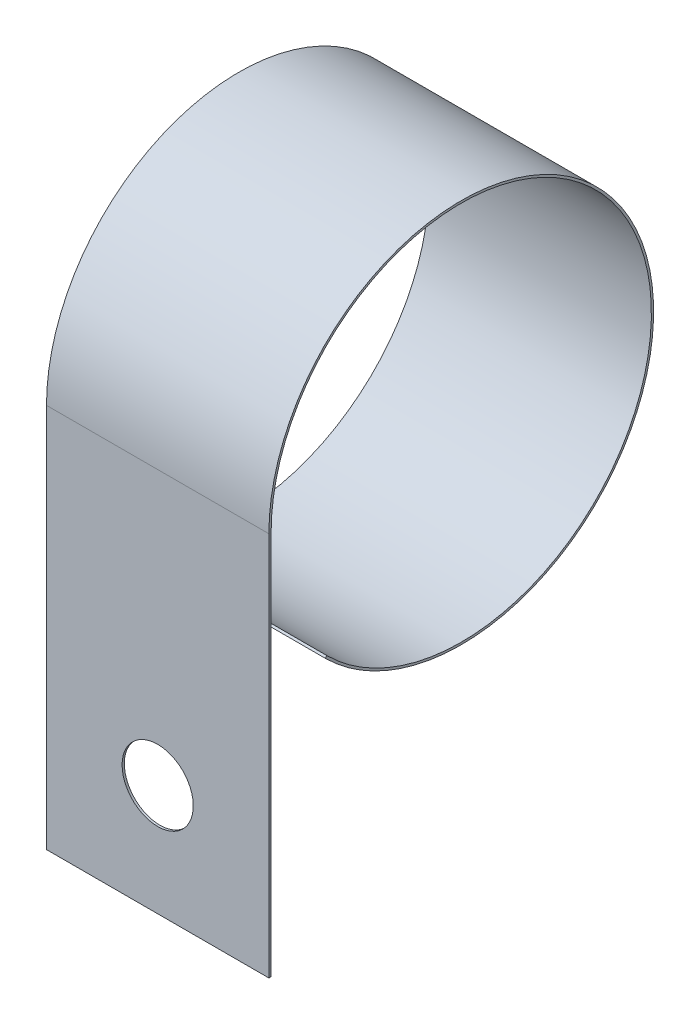
ISO-10303-21;
HEADER;
FILE_DESCRIPTION(('STEP AP214'),'2;1');
FILE_NAME('part.step','',(''),(''),'','','');
FILE_SCHEMA(('AUTOMOTIVE_DESIGN { 1 0 10303 214 1 1 1 1 }'));
ENDSEC;
DATA;
#1=APPLICATION_CONTEXT('core data for automotive mechanical design processes');
#2=APPLICATION_PROTOCOL_DEFINITION('international standard','automotive_design',2000,#1);
#3=PRODUCT_CONTEXT('',#1,'mechanical');
#4=PRODUCT('Part','Part','',(#3));
#5=PRODUCT_RELATED_PRODUCT_CATEGORY('part','',(#4));
#6=PRODUCT_DEFINITION_FORMATION('','',#4);
#7=PRODUCT_DEFINITION_CONTEXT('part definition',#1,'design');
#8=PRODUCT_DEFINITION('design','',#6,#7);
#9=PRODUCT_DEFINITION_SHAPE('','',#8);
#10=(LENGTH_UNIT() NAMED_UNIT(*) SI_UNIT(.MILLI.,.METRE.));
#11=(NAMED_UNIT(*) PLANE_ANGLE_UNIT() SI_UNIT($,.RADIAN.));
#12=(NAMED_UNIT(*) SI_UNIT($,.STERADIAN.) SOLID_ANGLE_UNIT());
#13=UNCERTAINTY_MEASURE_WITH_UNIT(LENGTH_MEASURE(1.E-05),#10,'distance_accuracy_value','');
#14=(GEOMETRIC_REPRESENTATION_CONTEXT(3) GLOBAL_UNCERTAINTY_ASSIGNED_CONTEXT((#13)) GLOBAL_UNIT_ASSIGNED_CONTEXT((#10,
#11,#12)) REPRESENTATION_CONTEXT('',''));
#15=CARTESIAN_POINT('',(0.,0.,0.));
#16=DIRECTION('',(0.,0.,1.));
#17=DIRECTION('',(1.,0.,0.));
#18=AXIS2_PLACEMENT_3D('',#15,#16,#17);
#19=CARTESIAN_POINT('',(5.,-17.3,8.65000000000003));
#20=DIRECTION('',(0.,0.,-1.));
#21=DIRECTION('',(0.,1.,0.));
#22=AXIS2_PLACEMENT_3D('',#19,#20,#21);
#23=PLANE('',#22);
#24=DIRECTION('',(0.,-1.,0.));
#25=VECTOR('',#24,1.);
#26=CARTESIAN_POINT('',(-5.,-17.3,8.65000000000003));
#27=LINE('',#26,#25);
#28=CARTESIAN_POINT('',(-5.,0.,8.65000000000003));
#29=VERTEX_POINT('',#28);
#30=CARTESIAN_POINT('',(-5.,-17.3,8.65000000000003));
#31=VERTEX_POINT('',#30);
#32=EDGE_CURVE('E129',#29,#31,#27,.T.);
#33=ORIENTED_EDGE('',*,*,#32,.T.);
#34=DIRECTION('',(-1.,0.,0.));
#35=VECTOR('',#34,1.);
#36=CARTESIAN_POINT('',(5.,-17.3,8.65000000000003));
#37=LINE('',#36,#35);
#38=CARTESIAN_POINT('',(5.,-17.3,8.65000000000003));
#39=VERTEX_POINT('',#38);
#40=EDGE_CURVE('E126',#39,#31,#37,.T.);
#41=ORIENTED_EDGE('',*,*,#40,.F.);
#42=DIRECTION('',(0.,-1.,0.));
#43=VECTOR('',#42,1.);
#44=CARTESIAN_POINT('',(5.,-17.3,8.65000000000003));
#45=LINE('',#44,#43);
#46=CARTESIAN_POINT('',(5.,0.,8.65000000000003));
#47=VERTEX_POINT('',#46);
#48=EDGE_CURVE('E114',#47,#39,#45,.T.);
#49=ORIENTED_EDGE('',*,*,#48,.F.);
#50=DIRECTION('',(-1.,0.,0.));
#51=VECTOR('',#50,1.);
#52=CARTESIAN_POINT('',(5.,0.,8.65000000000003));
#53=LINE('',#52,#51);
#54=EDGE_CURVE('E131',#47,#29,#53,.T.);
#55=ORIENTED_EDGE('',*,*,#54,.T.);
#56=EDGE_LOOP('',(#33,#41,#49,#55));
#57=FACE_BOUND('',#56,.T.);
#58=CARTESIAN_POINT('',(0.,-12.3,8.65000000000003));
#59=DIRECTION('',(0.,0.,-1.));
#60=DIRECTION('',(-1.,0.,0.));
#61=AXIS2_PLACEMENT_3D('',#58,#59,#60);
#62=CIRCLE('',#61,1.6);
#63=CARTESIAN_POINT('',(-1.6,-12.3,8.65000000000003));
#64=VERTEX_POINT('',#63);
#65=EDGE_CURVE('E146',#64,#64,#62,.T.);
#66=ORIENTED_EDGE('',*,*,#65,.T.);
#67=EDGE_LOOP('',(#66));
#68=FACE_BOUND('',#67,.T.);
#69=ADVANCED_FACE('F44',(#57,#68),#23,.F.);
#70=CARTESIAN_POINT('',(5.,-17.3,8.55000000000003));
#71=DIRECTION('',(0.,0.,1.));
#72=DIRECTION('',(0.,-1.,0.));
#73=AXIS2_PLACEMENT_3D('',#70,#71,#72);
#74=PLANE('',#73);
#75=DIRECTION('',(0.,1.,0.));
#76=VECTOR('',#75,1.);
#77=CARTESIAN_POINT('',(-5.,-17.3,8.55000000000003));
#78=LINE('',#77,#76);
#79=CARTESIAN_POINT('',(-5.,-17.3,8.55000000000003));
#80=VERTEX_POINT('',#79);
#81=CARTESIAN_POINT('',(-5.,0.,8.55000000000003));
#82=VERTEX_POINT('',#81);
#83=EDGE_CURVE('E98',#80,#82,#78,.T.);
#84=ORIENTED_EDGE('',*,*,#83,.T.);
#85=DIRECTION('',(-1.,0.,0.));
#86=VECTOR('',#85,1.);
#87=CARTESIAN_POINT('',(5.,0.,8.55000000000003));
#88=LINE('',#87,#86);
#89=CARTESIAN_POINT('',(5.,0.,8.55000000000003));
#90=VERTEX_POINT('',#89);
#91=EDGE_CURVE('E137',#90,#82,#88,.T.);
#92=ORIENTED_EDGE('',*,*,#91,.F.);
#93=DIRECTION('',(0.,1.,0.));
#94=VECTOR('',#93,1.);
#95=CARTESIAN_POINT('',(5.,-17.3,8.55000000000003));
#96=LINE('',#95,#94);
#97=CARTESIAN_POINT('',(5.,-17.3,8.55000000000003));
#98=VERTEX_POINT('',#97);
#99=EDGE_CURVE('E65',#98,#90,#96,.T.);
#100=ORIENTED_EDGE('',*,*,#99,.F.);
#101=DIRECTION('',(-1.,0.,0.));
#102=VECTOR('',#101,1.);
#103=CARTESIAN_POINT('',(5.,-17.3,8.55000000000003));
#104=LINE('',#103,#102);
#105=EDGE_CURVE('E132',#98,#80,#104,.T.);
#106=ORIENTED_EDGE('',*,*,#105,.T.);
#107=EDGE_LOOP('',(#84,#92,#100,#106));
#108=FACE_BOUND('',#107,.T.);
#109=CARTESIAN_POINT('',(0.,-12.3,8.55000000000003));
#110=DIRECTION('',(0.,0.,1.));
#111=DIRECTION('',(0.,-1.,0.));
#112=AXIS2_PLACEMENT_3D('',#109,#110,#111);
#113=CIRCLE('',#112,1.6);
#114=CARTESIAN_POINT('',(0.,-13.9,8.55000000000003));
#115=VERTEX_POINT('',#114);
#116=EDGE_CURVE('E181',#115,#115,#113,.T.);
#117=ORIENTED_EDGE('',*,*,#116,.T.);
#118=EDGE_LOOP('',(#117));
#119=FACE_BOUND('',#118,.T.);
#120=ADVANCED_FACE('F175',(#108,#119),#74,.F.);
#121=CARTESIAN_POINT('',(5.,0.,0.));
#122=DIRECTION('',(-1.,0.,0.));
#123=DIRECTION('',(0.,0.,1.));
#124=AXIS2_PLACEMENT_3D('',#121,#122,#123);
#125=CYLINDRICAL_SURFACE('',#124,8.55000000000003);
#126=CARTESIAN_POINT('',(-5.,0.,0.));
#127=DIRECTION('',(-1.,0.,0.));
#128=DIRECTION('',(0.,0.,1.));
#129=AXIS2_PLACEMENT_3D('',#126,#127,#128);
#130=CIRCLE('',#129,8.55000000000003);
#131=CARTESIAN_POINT('',(-5.,-6.04576297914498,6.04576297914503));
#132=VERTEX_POINT('',#131);
#133=EDGE_CURVE('E141',#82,#132,#130,.T.);
#134=ORIENTED_EDGE('',*,*,#133,.T.);
#135=DIRECTION('',(-1.,0.,0.));
#136=VECTOR('',#135,1.);
#137=CARTESIAN_POINT('',(5.,-6.04576297914498,6.04576297914503));
#138=LINE('',#137,#136);
#139=CARTESIAN_POINT('',(5.,-6.04576297914498,6.04576297914503));
#140=VERTEX_POINT('',#139);
#141=EDGE_CURVE('E11',#140,#132,#138,.T.);
#142=ORIENTED_EDGE('',*,*,#141,.F.);
#143=CARTESIAN_POINT('',(5.,0.,0.));
#144=DIRECTION('',(-1.,0.,0.));
#145=DIRECTION('',(0.,0.,1.));
#146=AXIS2_PLACEMENT_3D('',#143,#144,#145);
#147=CIRCLE('',#146,8.55000000000003);
#148=EDGE_CURVE('E158',#90,#140,#147,.T.);
#149=ORIENTED_EDGE('',*,*,#148,.F.);
#150=ORIENTED_EDGE('',*,*,#91,.T.);
#151=EDGE_LOOP('',(#134,#142,#149,#150));
#152=FACE_BOUND('',#151,.T.);
#153=ADVANCED_FACE('F46',(#152),#125,.F.);
#154=CARTESIAN_POINT('',(5.,-6.11647365726363,6.11647365726368));
#155=DIRECTION('',(0.,-0.707106781186539,-0.707106781186556));
#156=DIRECTION('',(0.,0.707106781186556,-0.707106781186539));
#157=AXIS2_PLACEMENT_3D('',#154,#155,#156);
#158=PLANE('',#157);
#159=DIRECTION('',(0.,-0.707106781186556,0.707106781186539));
#160=VECTOR('',#159,1.);
#161=CARTESIAN_POINT('',(-5.,-6.11647365726363,6.11647365726368));
#162=LINE('',#161,#160);
#163=CARTESIAN_POINT('',(-5.,-6.11647365726363,6.11647365726368));
#164=VERTEX_POINT('',#163);
#165=EDGE_CURVE('E145',#132,#164,#162,.T.);
#166=ORIENTED_EDGE('',*,*,#165,.T.);
#167=DIRECTION('',(-1.,0.,0.));
#168=VECTOR('',#167,1.);
#169=CARTESIAN_POINT('',(5.,-6.11647365726363,6.11647365726368));
#170=LINE('',#169,#168);
#171=CARTESIAN_POINT('',(5.,-6.11647365726363,6.11647365726368));
#172=VERTEX_POINT('',#171);
#173=EDGE_CURVE('E54',#172,#164,#170,.T.);
#174=ORIENTED_EDGE('',*,*,#173,.F.);
#175=DIRECTION('',(0.,-0.707106781186556,0.707106781186539));
#176=VECTOR('',#175,1.);
#177=CARTESIAN_POINT('',(5.,-6.11647365726363,6.11647365726368));
#178=LINE('',#177,#176);
#179=EDGE_CURVE('E107',#140,#172,#178,.T.);
#180=ORIENTED_EDGE('',*,*,#179,.F.);
#181=ORIENTED_EDGE('',*,*,#141,.T.);
#182=EDGE_LOOP('',(#166,#174,#180,#181));
#183=FACE_BOUND('',#182,.T.);
#184=ADVANCED_FACE('F210',(#183),#158,.F.);
#185=CARTESIAN_POINT('',(5.,0.,0.));
#186=DIRECTION('',(-1.,0.,0.));
#187=DIRECTION('',(0.,0.,1.));
#188=AXIS2_PLACEMENT_3D('',#185,#186,#187);
#189=CYLINDRICAL_SURFACE('',#188,8.65000000000003);
#190=CARTESIAN_POINT('',(-5.,0.,0.));
#191=DIRECTION('',(1.,0.,0.));
#192=DIRECTION('',(0.,0.,1.));
#193=AXIS2_PLACEMENT_3D('',#190,#191,#192);
#194=CIRCLE('',#193,8.65000000000003);
#195=EDGE_CURVE('E149',#164,#29,#194,.T.);
#196=ORIENTED_EDGE('',*,*,#195,.T.);
#197=ORIENTED_EDGE('',*,*,#54,.F.);
#198=CARTESIAN_POINT('',(5.,0.,0.));
#199=DIRECTION('',(1.,0.,0.));
#200=DIRECTION('',(0.,0.,1.));
#201=AXIS2_PLACEMENT_3D('',#198,#199,#200);
#202=CIRCLE('',#201,8.65000000000003);
#203=EDGE_CURVE('E120',#172,#47,#202,.T.);
#204=ORIENTED_EDGE('',*,*,#203,.F.);
#205=ORIENTED_EDGE('',*,*,#173,.T.);
#206=EDGE_LOOP('',(#196,#197,#204,#205));
#207=FACE_BOUND('',#206,.T.);
#208=ADVANCED_FACE('F168',(#207),#189,.T.);
#209=CARTESIAN_POINT('',(5.,-17.3,8.55000000000003));
#210=DIRECTION('',(0.,1.,0.));
#211=DIRECTION('',(0.,0.,1.));
#212=AXIS2_PLACEMENT_3D('',#209,#210,#211);
#213=PLANE('',#212);
#214=DIRECTION('',(0.,0.,-1.));
#215=VECTOR('',#214,1.);
#216=CARTESIAN_POINT('',(-5.,-17.3,8.55000000000003));
#217=LINE('',#216,#215);
#218=EDGE_CURVE('E92',#31,#80,#217,.T.);
#219=ORIENTED_EDGE('',*,*,#218,.T.);
#220=ORIENTED_EDGE('',*,*,#105,.F.);
#221=DIRECTION('',(0.,0.,-1.));
#222=VECTOR('',#221,1.);
#223=CARTESIAN_POINT('',(5.,-17.3,8.55000000000003));
#224=LINE('',#223,#222);
#225=EDGE_CURVE('E118',#39,#98,#224,.T.);
#226=ORIENTED_EDGE('',*,*,#225,.F.);
#227=ORIENTED_EDGE('',*,*,#40,.T.);
#228=EDGE_LOOP('',(#219,#220,#226,#227));
#229=FACE_BOUND('',#228,.T.);
#230=ADVANCED_FACE('F134',(#229),#213,.F.);
#231=CARTESIAN_POINT('',(5.,0.,0.));
#232=DIRECTION('',(-1.,0.,0.));
#233=DIRECTION('',(0.,0.,1.));
#234=AXIS2_PLACEMENT_3D('',#231,#232,#233);
#235=PLANE('',#234);
#236=ORIENTED_EDGE('',*,*,#148,.T.);
#237=ORIENTED_EDGE('',*,*,#179,.T.);
#238=ORIENTED_EDGE('',*,*,#203,.T.);
#239=ORIENTED_EDGE('',*,*,#48,.T.);
#240=ORIENTED_EDGE('',*,*,#225,.T.);
#241=ORIENTED_EDGE('',*,*,#99,.T.);
#242=EDGE_LOOP('',(#236,#237,#238,#239,#240,#241));
#243=FACE_BOUND('',#242,.T.);
#244=ADVANCED_FACE('F116',(#243),#235,.F.);
#245=CARTESIAN_POINT('',(-5.,0.,0.));
#246=DIRECTION('',(-1.,0.,0.));
#247=DIRECTION('',(0.,0.,1.));
#248=AXIS2_PLACEMENT_3D('',#245,#246,#247);
#249=PLANE('',#248);
#250=ORIENTED_EDGE('',*,*,#133,.F.);
#251=ORIENTED_EDGE('',*,*,#83,.F.);
#252=ORIENTED_EDGE('',*,*,#218,.F.);
#253=ORIENTED_EDGE('',*,*,#32,.F.);
#254=ORIENTED_EDGE('',*,*,#195,.F.);
#255=ORIENTED_EDGE('',*,*,#165,.F.);
#256=EDGE_LOOP('',(#250,#251,#252,#253,#254,#255));
#257=FACE_BOUND('',#256,.T.);
#258=ADVANCED_FACE('F171',(#257),#249,.T.);
#259=CARTESIAN_POINT('',(0.,-12.3,-8.65100000000003));
#260=DIRECTION('',(0.,0.,1.));
#261=DIRECTION('',(1.,0.,0.));
#262=AXIS2_PLACEMENT_3D('',#259,#260,#261);
#263=CYLINDRICAL_SURFACE('',#262,1.6);
#264=ORIENTED_EDGE('',*,*,#65,.F.);
#265=EDGE_LOOP('',(#264));
#266=FACE_BOUND('',#265,.T.);
#267=ORIENTED_EDGE('',*,*,#116,.F.);
#268=EDGE_LOOP('',(#267));
#269=FACE_BOUND('',#268,.T.);
#270=ADVANCED_FACE('F195',(#266,#269),#263,.F.);
#271=CLOSED_SHELL('',(#69,#120,#153,#184,#208,#230,#244,#258,#270));
#272=MANIFOLD_SOLID_BREP('B2',#271);
#273=ADVANCED_BREP_SHAPE_REPRESENTATION('',(#18,#272),#14);
#274=SHAPE_DEFINITION_REPRESENTATION(#9,#273);
ENDSEC;
END-ISO-10303-21;
